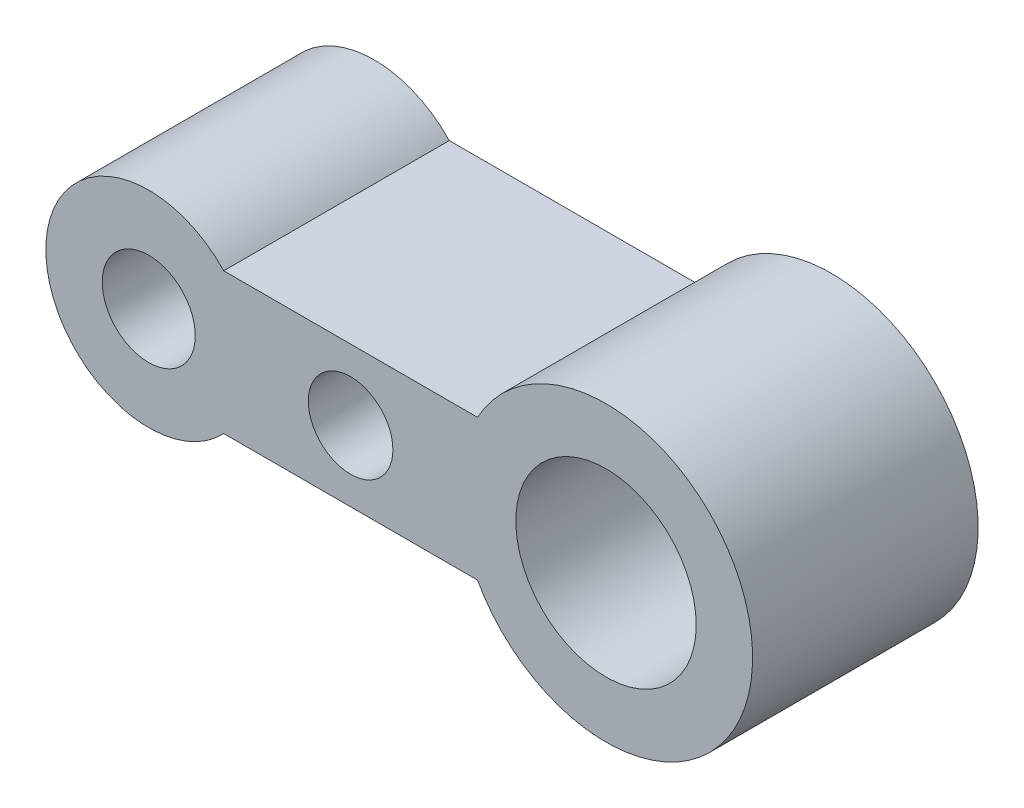
ISO-10303-21;
HEADER;
FILE_DESCRIPTION(('STEP AP214'),'2;1');
FILE_NAME('part.step','',(''),(''),'','','');
FILE_SCHEMA(('AUTOMOTIVE_DESIGN { 1 0 10303 214 1 1 1 1 }'));
ENDSEC;
DATA;
#1=APPLICATION_CONTEXT('core data for automotive mechanical design processes');
#2=APPLICATION_PROTOCOL_DEFINITION('international standard','automotive_design',2000,#1);
#3=PRODUCT_CONTEXT('',#1,'mechanical');
#4=PRODUCT('Part','Part','',(#3));
#5=PRODUCT_RELATED_PRODUCT_CATEGORY('part','',(#4));
#6=PRODUCT_DEFINITION_FORMATION('','',#4);
#7=PRODUCT_DEFINITION_CONTEXT('part definition',#1,'design');
#8=PRODUCT_DEFINITION('design','',#6,#7);
#9=PRODUCT_DEFINITION_SHAPE('','',#8);
#10=(LENGTH_UNIT() NAMED_UNIT(*) SI_UNIT(.MILLI.,.METRE.));
#11=(NAMED_UNIT(*) PLANE_ANGLE_UNIT() SI_UNIT($,.RADIAN.));
#12=(NAMED_UNIT(*) SI_UNIT($,.STERADIAN.) SOLID_ANGLE_UNIT());
#13=UNCERTAINTY_MEASURE_WITH_UNIT(LENGTH_MEASURE(1.E-05),#10,'distance_accuracy_value','');
#14=(GEOMETRIC_REPRESENTATION_CONTEXT(3) GLOBAL_UNCERTAINTY_ASSIGNED_CONTEXT((#13)) GLOBAL_UNIT_ASSIGNED_CONTEXT((#10,
#11,#12)) REPRESENTATION_CONTEXT('',''));
#15=CARTESIAN_POINT('',(0.,0.,0.));
#16=DIRECTION('',(0.,0.,1.));
#17=DIRECTION('',(1.,0.,0.));
#18=AXIS2_PLACEMENT_3D('',#15,#16,#17);
#19=CARTESIAN_POINT('',(0.,-2.5,8.));
#20=DIRECTION('',(0.,1.,0.));
#21=DIRECTION('',(0.,0.,1.));
#22=AXIS2_PLACEMENT_3D('',#19,#20,#21);
#23=PLANE('',#22);
#24=DIRECTION('',(1.,0.,0.));
#25=VECTOR('',#24,1.);
#26=CARTESIAN_POINT('',(0.,-2.5,0.));
#27=LINE('',#26,#25);
#28=CARTESIAN_POINT('',(2.65941722939444,-2.5,0.));
#29=VERTEX_POINT('',#28);
#30=CARTESIAN_POINT('',(11.6594172293944,-2.5,0.));
#31=VERTEX_POINT('',#30);
#32=EDGE_CURVE('E105',#29,#31,#27,.T.);
#33=ORIENTED_EDGE('',*,*,#32,.T.);
#34=DIRECTION('',(0.,0.,-1.));
#35=VECTOR('',#34,1.);
#36=CARTESIAN_POINT('',(11.6594172293944,-2.5,8.));
#37=LINE('',#36,#35);
#38=CARTESIAN_POINT('',(11.6594172293944,-2.5,8.));
#39=VERTEX_POINT('',#38);
#40=EDGE_CURVE('E11',#39,#31,#37,.T.);
#41=ORIENTED_EDGE('',*,*,#40,.F.);
#42=DIRECTION('',(1.,0.,0.));
#43=VECTOR('',#42,1.);
#44=CARTESIAN_POINT('',(0.,-2.5,8.));
#45=LINE('',#44,#43);
#46=CARTESIAN_POINT('',(2.65941722939444,-2.5,8.));
#47=VERTEX_POINT('',#46);
#48=EDGE_CURVE('E84',#47,#39,#45,.T.);
#49=ORIENTED_EDGE('',*,*,#48,.F.);
#50=DIRECTION('',(0.,0.,-1.));
#51=VECTOR('',#50,1.);
#52=CARTESIAN_POINT('',(2.65941722939444,-2.5,8.));
#53=LINE('',#52,#51);
#54=EDGE_CURVE('E101',#47,#29,#53,.T.);
#55=ORIENTED_EDGE('',*,*,#54,.T.);
#56=EDGE_LOOP('',(#33,#41,#49,#55));
#57=FACE_BOUND('',#56,.T.);
#58=ADVANCED_FACE('F35',(#57),#23,.F.);
#59=CARTESIAN_POINT('',(16.2190224754656,0.,8.));
#60=DIRECTION('',(0.,0.,-1.));
#61=DIRECTION('',(-1.,0.,0.));
#62=AXIS2_PLACEMENT_3D('',#59,#60,#61);
#63=CYLINDRICAL_SURFACE('',#62,5.2);
#64=CARTESIAN_POINT('',(16.2190224754656,0.,0.));
#65=DIRECTION('',(0.,0.,1.));
#66=DIRECTION('',(1.,0.,0.));
#67=AXIS2_PLACEMENT_3D('',#64,#65,#66);
#68=CIRCLE('',#67,5.2);
#69=CARTESIAN_POINT('',(11.6594172293944,2.5,0.));
#70=VERTEX_POINT('',#69);
#71=EDGE_CURVE('E89',#31,#70,#68,.T.);
#72=ORIENTED_EDGE('',*,*,#71,.T.);
#73=DIRECTION('',(0.,0.,-1.));
#74=VECTOR('',#73,1.);
#75=CARTESIAN_POINT('',(11.6594172293944,2.5,8.));
#76=LINE('',#75,#74);
#77=CARTESIAN_POINT('',(11.6594172293944,2.5,8.));
#78=VERTEX_POINT('',#77);
#79=EDGE_CURVE('E44',#78,#70,#76,.T.);
#80=ORIENTED_EDGE('',*,*,#79,.F.);
#81=CARTESIAN_POINT('',(16.2190224754656,0.,8.));
#82=DIRECTION('',(0.,0.,1.));
#83=DIRECTION('',(1.,0.,0.));
#84=AXIS2_PLACEMENT_3D('',#81,#82,#83);
#85=CIRCLE('',#84,5.2);
#86=EDGE_CURVE('E78',#39,#78,#85,.T.);
#87=ORIENTED_EDGE('',*,*,#86,.F.);
#88=ORIENTED_EDGE('',*,*,#40,.T.);
#89=EDGE_LOOP('',(#72,#80,#87,#88));
#90=FACE_BOUND('',#89,.T.);
#91=ADVANCED_FACE('F88',(#90),#63,.T.);
#92=CARTESIAN_POINT('',(0.,2.5,8.));
#93=DIRECTION('',(0.,1.,0.));
#94=DIRECTION('',(0.,0.,1.));
#95=AXIS2_PLACEMENT_3D('',#92,#93,#94);
#96=PLANE('',#95);
#97=DIRECTION('',(1.,0.,0.));
#98=VECTOR('',#97,1.);
#99=CARTESIAN_POINT('',(0.,2.5,0.));
#100=LINE('',#99,#98);
#101=CARTESIAN_POINT('',(2.65941722939444,2.5,0.));
#102=VERTEX_POINT('',#101);
#103=EDGE_CURVE('E110',#102,#70,#100,.T.);
#104=ORIENTED_EDGE('',*,*,#103,.F.);
#105=DIRECTION('',(0.,0.,-1.));
#106=VECTOR('',#105,1.);
#107=CARTESIAN_POINT('',(2.65941722939444,2.5,8.));
#108=LINE('',#107,#106);
#109=CARTESIAN_POINT('',(2.65941722939444,2.5,8.));
#110=VERTEX_POINT('',#109);
#111=EDGE_CURVE('E68',#110,#102,#108,.T.);
#112=ORIENTED_EDGE('',*,*,#111,.F.);
#113=DIRECTION('',(1.,0.,0.));
#114=VECTOR('',#113,1.);
#115=CARTESIAN_POINT('',(0.,2.5,8.));
#116=LINE('',#115,#114);
#117=EDGE_CURVE('E82',#110,#78,#116,.T.);
#118=ORIENTED_EDGE('',*,*,#117,.T.);
#119=ORIENTED_EDGE('',*,*,#79,.T.);
#120=EDGE_LOOP('',(#104,#112,#118,#119));
#121=FACE_BOUND('',#120,.T.);
#122=ADVANCED_FACE('F93',(#121),#96,.T.);
#123=CARTESIAN_POINT('',(0.,0.,8.));
#124=DIRECTION('',(0.,0.,-1.));
#125=DIRECTION('',(-1.,0.,0.));
#126=AXIS2_PLACEMENT_3D('',#123,#124,#125);
#127=CYLINDRICAL_SURFACE('',#126,3.65);
#128=CARTESIAN_POINT('',(0.,0.,0.));
#129=DIRECTION('',(0.,0.,1.));
#130=DIRECTION('',(1.,0.,0.));
#131=AXIS2_PLACEMENT_3D('',#128,#129,#130);
#132=CIRCLE('',#131,3.65);
#133=EDGE_CURVE('E71',#102,#29,#132,.T.);
#134=ORIENTED_EDGE('',*,*,#133,.T.);
#135=ORIENTED_EDGE('',*,*,#54,.F.);
#136=CARTESIAN_POINT('',(0.,0.,8.));
#137=DIRECTION('',(0.,0.,1.));
#138=DIRECTION('',(1.,0.,0.));
#139=AXIS2_PLACEMENT_3D('',#136,#137,#138);
#140=CIRCLE('',#139,3.65);
#141=EDGE_CURVE('E52',#110,#47,#140,.T.);
#142=ORIENTED_EDGE('',*,*,#141,.F.);
#143=ORIENTED_EDGE('',*,*,#111,.T.);
#144=EDGE_LOOP('',(#134,#135,#142,#143));
#145=FACE_BOUND('',#144,.T.);
#146=ADVANCED_FACE('F139',(#145),#127,.T.);
#147=CARTESIAN_POINT('',(16.2190224754656,0.,8.));
#148=DIRECTION('',(0.,0.,-1.));
#149=DIRECTION('',(-1.,0.,0.));
#150=AXIS2_PLACEMENT_3D('',#147,#148,#149);
#151=CYLINDRICAL_SURFACE('',#150,3.2);
#152=CARTESIAN_POINT('',(16.2190224754656,0.,8.));
#153=DIRECTION('',(0.,0.,1.));
#154=DIRECTION('',(1.,0.,0.));
#155=AXIS2_PLACEMENT_3D('',#152,#153,#154);
#156=CIRCLE('',#155,3.2);
#157=CARTESIAN_POINT('',(19.4190224754656,0.,8.));
#158=VERTEX_POINT('',#157);
#159=EDGE_CURVE('E116',#158,#158,#156,.T.);
#160=ORIENTED_EDGE('',*,*,#159,.T.);
#161=EDGE_LOOP('',(#160));
#162=FACE_BOUND('',#161,.T.);
#163=CARTESIAN_POINT('',(16.2190224754656,0.,0.));
#164=DIRECTION('',(0.,0.,1.));
#165=DIRECTION('',(1.,0.,0.));
#166=AXIS2_PLACEMENT_3D('',#163,#164,#165);
#167=CIRCLE('',#166,3.2);
#168=CARTESIAN_POINT('',(19.4190224754656,0.,0.));
#169=VERTEX_POINT('',#168);
#170=EDGE_CURVE('E102',#169,#169,#167,.T.);
#171=ORIENTED_EDGE('',*,*,#170,.F.);
#172=EDGE_LOOP('',(#171));
#173=FACE_BOUND('',#172,.T.);
#174=ADVANCED_FACE('F37',(#162,#173),#151,.F.);
#175=CARTESIAN_POINT('',(0.,0.,8.));
#176=DIRECTION('',(0.,0.,-1.));
#177=DIRECTION('',(-1.,0.,0.));
#178=AXIS2_PLACEMENT_3D('',#175,#176,#177);
#179=CYLINDRICAL_SURFACE('',#178,1.65);
#180=CARTESIAN_POINT('',(0.,0.,8.));
#181=DIRECTION('',(0.,0.,1.));
#182=DIRECTION('',(1.,0.,0.));
#183=AXIS2_PLACEMENT_3D('',#180,#181,#182);
#184=CIRCLE('',#183,1.65);
#185=CARTESIAN_POINT('',(1.65,0.,8.));
#186=VERTEX_POINT('',#185);
#187=EDGE_CURVE('E95',#186,#186,#184,.T.);
#188=ORIENTED_EDGE('',*,*,#187,.T.);
#189=EDGE_LOOP('',(#188));
#190=FACE_BOUND('',#189,.T.);
#191=CARTESIAN_POINT('',(0.,0.,0.));
#192=DIRECTION('',(0.,0.,1.));
#193=DIRECTION('',(1.,0.,0.));
#194=AXIS2_PLACEMENT_3D('',#191,#192,#193);
#195=CIRCLE('',#194,1.65);
#196=CARTESIAN_POINT('',(1.65,0.,0.));
#197=VERTEX_POINT('',#196);
#198=EDGE_CURVE('E113',#197,#197,#195,.T.);
#199=ORIENTED_EDGE('',*,*,#198,.F.);
#200=EDGE_LOOP('',(#199));
#201=FACE_BOUND('',#200,.T.);
#202=ADVANCED_FACE('F129',(#190,#201),#179,.F.);
#203=CARTESIAN_POINT('',(0.,0.,8.));
#204=DIRECTION('',(0.,0.,1.));
#205=DIRECTION('',(1.,0.,0.));
#206=AXIS2_PLACEMENT_3D('',#203,#204,#205);
#207=PLANE('',#206);
#208=CARTESIAN_POINT('',(7.15941722939444,0.,8.));
#209=DIRECTION('',(0.,0.,1.));
#210=DIRECTION('',(1.,0.,0.));
#211=AXIS2_PLACEMENT_3D('',#208,#209,#210);
#212=CIRCLE('',#211,1.5);
#213=CARTESIAN_POINT('',(8.65941722939444,0.,8.));
#214=VERTEX_POINT('',#213);
#215=EDGE_CURVE('E106',#214,#214,#212,.T.);
#216=ORIENTED_EDGE('',*,*,#215,.F.);
#217=EDGE_LOOP('',(#216));
#218=FACE_BOUND('',#217,.T.);
#219=ORIENTED_EDGE('',*,*,#159,.F.);
#220=EDGE_LOOP('',(#219));
#221=FACE_BOUND('',#220,.T.);
#222=ORIENTED_EDGE('',*,*,#48,.T.);
#223=ORIENTED_EDGE('',*,*,#86,.T.);
#224=ORIENTED_EDGE('',*,*,#117,.F.);
#225=ORIENTED_EDGE('',*,*,#141,.T.);
#226=EDGE_LOOP('',(#222,#223,#224,#225));
#227=FACE_BOUND('',#226,.T.);
#228=ORIENTED_EDGE('',*,*,#187,.F.);
#229=EDGE_LOOP('',(#228));
#230=FACE_BOUND('',#229,.T.);
#231=ADVANCED_FACE('F79',(#218,#221,#227,#230),#207,.T.);
#232=CARTESIAN_POINT('',(0.,0.,0.));
#233=DIRECTION('',(0.,0.,1.));
#234=DIRECTION('',(1.,0.,0.));
#235=AXIS2_PLACEMENT_3D('',#232,#233,#234);
#236=PLANE('',#235);
#237=CARTESIAN_POINT('',(7.15941722939444,0.,0.));
#238=DIRECTION('',(0.,0.,-1.));
#239=DIRECTION('',(-1.,0.,0.));
#240=AXIS2_PLACEMENT_3D('',#237,#238,#239);
#241=CIRCLE('',#240,1.5);
#242=CARTESIAN_POINT('',(5.65941722939444,0.,0.));
#243=VERTEX_POINT('',#242);
#244=EDGE_CURVE('E196',#243,#243,#241,.T.);
#245=ORIENTED_EDGE('',*,*,#244,.F.);
#246=EDGE_LOOP('',(#245));
#247=FACE_BOUND('',#246,.T.);
#248=ORIENTED_EDGE('',*,*,#170,.T.);
#249=EDGE_LOOP('',(#248));
#250=FACE_BOUND('',#249,.T.);
#251=ORIENTED_EDGE('',*,*,#32,.F.);
#252=ORIENTED_EDGE('',*,*,#133,.F.);
#253=ORIENTED_EDGE('',*,*,#103,.T.);
#254=ORIENTED_EDGE('',*,*,#71,.F.);
#255=EDGE_LOOP('',(#251,#252,#253,#254));
#256=FACE_BOUND('',#255,.T.);
#257=ORIENTED_EDGE('',*,*,#198,.T.);
#258=EDGE_LOOP('',(#257));
#259=FACE_BOUND('',#258,.T.);
#260=ADVANCED_FACE('F121',(#247,#250,#256,#259),#236,.F.);
#261=CARTESIAN_POINT('',(7.15941722939444,0.,21.5));
#262=DIRECTION('',(0.,0.,-1.));
#263=DIRECTION('',(-1.,0.,0.));
#264=AXIS2_PLACEMENT_3D('',#261,#262,#263);
#265=CYLINDRICAL_SURFACE('',#264,1.5);
#266=ORIENTED_EDGE('',*,*,#215,.T.);
#267=EDGE_LOOP('',(#266));
#268=FACE_BOUND('',#267,.T.);
#269=ORIENTED_EDGE('',*,*,#244,.T.);
#270=EDGE_LOOP('',(#269));
#271=FACE_BOUND('',#270,.T.);
#272=ADVANCED_FACE('F124',(#268,#271),#265,.F.);
#273=CLOSED_SHELL('',(#58,#91,#122,#146,#174,#202,#231,#260,#272));
#274=MANIFOLD_SOLID_BREP('B2',#273);
#275=ADVANCED_BREP_SHAPE_REPRESENTATION('',(#18,#274),#14);
#276=SHAPE_DEFINITION_REPRESENTATION(#9,#275);
ENDSEC;
END-ISO-10303-21;
